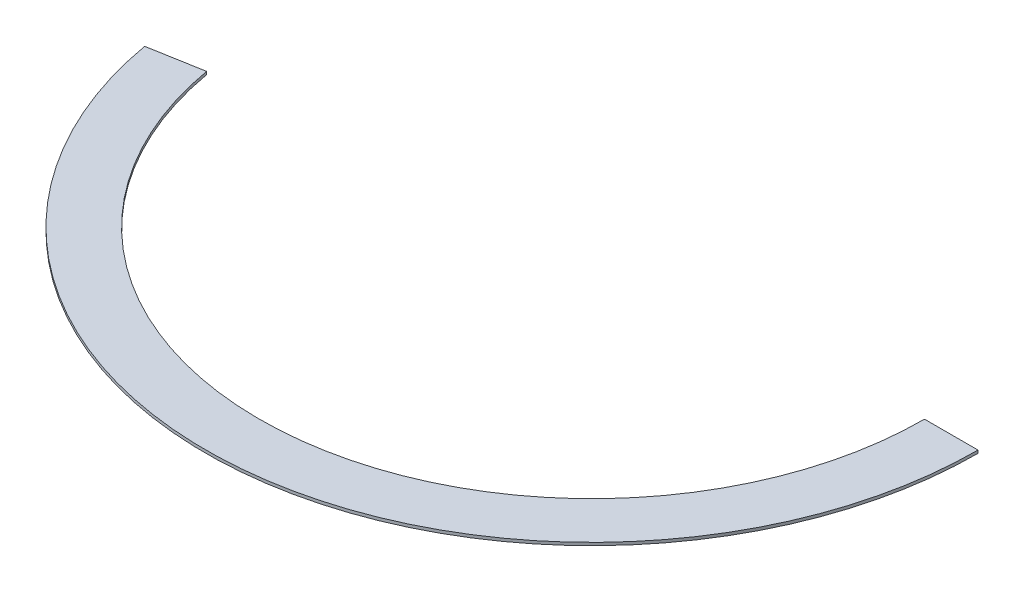
ISO-10303-21;
HEADER;
FILE_DESCRIPTION(('STEP AP214'),'2;1');
FILE_NAME('part.step','',(''),(''),'','','');
FILE_SCHEMA(('AUTOMOTIVE_DESIGN { 1 0 10303 214 1 1 1 1 }'));
ENDSEC;
DATA;
#1=APPLICATION_CONTEXT('core data for automotive mechanical design processes');
#2=APPLICATION_PROTOCOL_DEFINITION('international standard','automotive_design',2000,#1);
#3=PRODUCT_CONTEXT('',#1,'mechanical');
#4=PRODUCT('Part','Part','',(#3));
#5=PRODUCT_RELATED_PRODUCT_CATEGORY('part','',(#4));
#6=PRODUCT_DEFINITION_FORMATION('','',#4);
#7=PRODUCT_DEFINITION_CONTEXT('part definition',#1,'design');
#8=PRODUCT_DEFINITION('design','',#6,#7);
#9=PRODUCT_DEFINITION_SHAPE('','',#8);
#10=(LENGTH_UNIT() NAMED_UNIT(*) SI_UNIT(.MILLI.,.METRE.));
#11=(NAMED_UNIT(*) PLANE_ANGLE_UNIT() SI_UNIT($,.RADIAN.));
#12=(NAMED_UNIT(*) SI_UNIT($,.STERADIAN.) SOLID_ANGLE_UNIT());
#13=UNCERTAINTY_MEASURE_WITH_UNIT(LENGTH_MEASURE(1.E-05),#10,'distance_accuracy_value','');
#14=(GEOMETRIC_REPRESENTATION_CONTEXT(3) GLOBAL_UNCERTAINTY_ASSIGNED_CONTEXT((#13)) GLOBAL_UNIT_ASSIGNED_CONTEXT((#10,
#11,#12)) REPRESENTATION_CONTEXT('',''));
#15=CARTESIAN_POINT('',(0.,0.,0.));
#16=DIRECTION('',(0.,0.,1.));
#17=DIRECTION('',(1.,0.,0.));
#18=AXIS2_PLACEMENT_3D('',#15,#16,#17);
#19=CARTESIAN_POINT('',(0.,0.7,0.));
#20=DIRECTION('',(0.,-1.,0.));
#21=DIRECTION('',(0.,0.,-1.));
#22=AXIS2_PLACEMENT_3D('',#19,#20,#21);
#23=CYLINDRICAL_SURFACE('',#22,93.83);
#24=CARTESIAN_POINT('',(0.,0.,0.));
#25=DIRECTION('',(0.,1.,0.));
#26=DIRECTION('',(0.,0.,1.));
#27=AXIS2_PLACEMENT_3D('',#24,#25,#26);
#28=CIRCLE('',#27,93.83);
#29=CARTESIAN_POINT('',(-92.4045114651354,0.,16.2934085104888));
#30=VERTEX_POINT('',#29);
#31=CARTESIAN_POINT('',(93.83,0.,0.));
#32=VERTEX_POINT('',#31);
#33=EDGE_CURVE('E98',#30,#32,#28,.T.);
#34=ORIENTED_EDGE('',*,*,#33,.T.);
#35=DIRECTION('',(0.,-1.,0.));
#36=VECTOR('',#35,1.);
#37=CARTESIAN_POINT('',(93.83,0.7,0.));
#38=LINE('',#37,#36);
#39=CARTESIAN_POINT('',(93.83,0.7,0.));
#40=VERTEX_POINT('',#39);
#41=EDGE_CURVE('E11',#40,#32,#38,.T.);
#42=ORIENTED_EDGE('',*,*,#41,.F.);
#43=CARTESIAN_POINT('',(0.,0.7,0.));
#44=DIRECTION('',(0.,1.,0.));
#45=DIRECTION('',(0.,0.,1.));
#46=AXIS2_PLACEMENT_3D('',#43,#44,#45);
#47=CIRCLE('',#46,93.83);
#48=CARTESIAN_POINT('',(-92.4045114651354,0.7,16.2934085104888));
#49=VERTEX_POINT('',#48);
#50=EDGE_CURVE('E86',#49,#40,#47,.T.);
#51=ORIENTED_EDGE('',*,*,#50,.F.);
#52=DIRECTION('',(0.,-1.,0.));
#53=VECTOR('',#52,1.);
#54=CARTESIAN_POINT('',(-92.4045114651354,0.7,16.2934085104888));
#55=LINE('',#54,#53);
#56=EDGE_CURVE('E94',#49,#30,#55,.T.);
#57=ORIENTED_EDGE('',*,*,#56,.T.);
#58=EDGE_LOOP('',(#34,#42,#51,#57));
#59=FACE_BOUND('',#58,.T.);
#60=ADVANCED_FACE('F35',(#59),#23,.T.);
#61=CARTESIAN_POINT('',(80.83,0.7,0.));
#62=DIRECTION('',(0.,0.,1.));
#63=DIRECTION('',(1.,0.,0.));
#64=AXIS2_PLACEMENT_3D('',#61,#62,#63);
#65=PLANE('',#64);
#66=DIRECTION('',(-1.,0.,0.));
#67=VECTOR('',#66,1.);
#68=CARTESIAN_POINT('',(80.83,0.,0.));
#69=LINE('',#68,#67);
#70=CARTESIAN_POINT('',(80.83,0.,0.));
#71=VERTEX_POINT('',#70);
#72=EDGE_CURVE('E90',#32,#71,#69,.T.);
#73=ORIENTED_EDGE('',*,*,#72,.T.);
#74=DIRECTION('',(0.,-1.,0.));
#75=VECTOR('',#74,1.);
#76=CARTESIAN_POINT('',(80.83,0.7,0.));
#77=LINE('',#76,#75);
#78=CARTESIAN_POINT('',(80.83,0.7,0.));
#79=VERTEX_POINT('',#78);
#80=EDGE_CURVE('E43',#79,#71,#77,.T.);
#81=ORIENTED_EDGE('',*,*,#80,.F.);
#82=DIRECTION('',(-1.,0.,0.));
#83=VECTOR('',#82,1.);
#84=CARTESIAN_POINT('',(80.83,0.7,0.));
#85=LINE('',#84,#83);
#86=EDGE_CURVE('E81',#40,#79,#85,.T.);
#87=ORIENTED_EDGE('',*,*,#86,.F.);
#88=ORIENTED_EDGE('',*,*,#41,.T.);
#89=EDGE_LOOP('',(#73,#81,#87,#88));
#90=FACE_BOUND('',#89,.T.);
#91=ADVANCED_FACE('F89',(#90),#65,.F.);
#92=CARTESIAN_POINT('',(0.,0.7,0.));
#93=DIRECTION('',(0.,-1.,0.));
#94=DIRECTION('',(0.,0.,-1.));
#95=AXIS2_PLACEMENT_3D('',#92,#93,#94);
#96=CYLINDRICAL_SURFACE('',#95,80.83);
#97=CARTESIAN_POINT('',(0.,0.,0.));
#98=DIRECTION('',(0.,-1.,0.));
#99=DIRECTION('',(0.,0.,-1.));
#100=AXIS2_PLACEMENT_3D('',#97,#98,#99);
#101=CIRCLE('',#100,80.83);
#102=CARTESIAN_POINT('',(-79.6020106759767,0.,14.0359822008186));
#103=VERTEX_POINT('',#102);
#104=EDGE_CURVE('E68',#71,#103,#101,.T.);
#105=ORIENTED_EDGE('',*,*,#104,.T.);
#106=DIRECTION('',(0.,-1.,0.));
#107=VECTOR('',#106,1.);
#108=CARTESIAN_POINT('',(-79.6020106759767,0.7,14.0359822008186));
#109=LINE('',#108,#107);
#110=CARTESIAN_POINT('',(-79.6020106759767,0.7,14.0359822008186));
#111=VERTEX_POINT('',#110);
#112=EDGE_CURVE('E91',#111,#103,#109,.T.);
#113=ORIENTED_EDGE('',*,*,#112,.F.);
#114=CARTESIAN_POINT('',(0.,0.7,0.));
#115=DIRECTION('',(0.,-1.,0.));
#116=DIRECTION('',(0.,0.,-1.));
#117=AXIS2_PLACEMENT_3D('',#114,#115,#116);
#118=CIRCLE('',#117,80.83);
#119=EDGE_CURVE('E84',#79,#111,#118,.T.);
#120=ORIENTED_EDGE('',*,*,#119,.F.);
#121=ORIENTED_EDGE('',*,*,#80,.T.);
#122=EDGE_LOOP('',(#105,#113,#120,#121));
#123=FACE_BOUND('',#122,.T.);
#124=ADVANCED_FACE('F92',(#123),#96,.F.);
#125=CARTESIAN_POINT('',(-79.6020106759767,0.7,14.0359822008186));
#126=DIRECTION('',(0.173648177666938,0.,0.984807753012207));
#127=DIRECTION('',(0.984807753012207,0.,-0.173648177666938));
#128=AXIS2_PLACEMENT_3D('',#125,#126,#127);
#129=PLANE('',#128);
#130=DIRECTION('',(-0.984807753012207,0.,0.173648177666938));
#131=VECTOR('',#130,1.);
#132=CARTESIAN_POINT('',(-79.6020106759767,0.,14.0359822008186));
#133=LINE('',#132,#131);
#134=EDGE_CURVE('E74',#103,#30,#133,.T.);
#135=ORIENTED_EDGE('',*,*,#134,.T.);
#136=ORIENTED_EDGE('',*,*,#56,.F.);
#137=DIRECTION('',(-0.984807753012207,0.,0.173648177666938));
#138=VECTOR('',#137,1.);
#139=CARTESIAN_POINT('',(-79.6020106759767,0.7,14.0359822008186));
#140=LINE('',#139,#138);
#141=EDGE_CURVE('E51',#111,#49,#140,.T.);
#142=ORIENTED_EDGE('',*,*,#141,.F.);
#143=ORIENTED_EDGE('',*,*,#112,.T.);
#144=EDGE_LOOP('',(#135,#136,#142,#143));
#145=FACE_BOUND('',#144,.T.);
#146=ADVANCED_FACE('F105',(#145),#129,.F.);
#147=CARTESIAN_POINT('',(0.,0.7,0.));
#148=DIRECTION('',(0.,1.,0.));
#149=DIRECTION('',(0.,0.,1.));
#150=AXIS2_PLACEMENT_3D('',#147,#148,#149);
#151=PLANE('',#150);
#152=ORIENTED_EDGE('',*,*,#50,.T.);
#153=ORIENTED_EDGE('',*,*,#86,.T.);
#154=ORIENTED_EDGE('',*,*,#119,.T.);
#155=ORIENTED_EDGE('',*,*,#141,.T.);
#156=EDGE_LOOP('',(#152,#153,#154,#155));
#157=FACE_BOUND('',#156,.T.);
#158=ADVANCED_FACE('F82',(#157),#151,.T.);
#159=CARTESIAN_POINT('',(0.,0.,0.));
#160=DIRECTION('',(0.,1.,0.));
#161=DIRECTION('',(0.,0.,1.));
#162=AXIS2_PLACEMENT_3D('',#159,#160,#161);
#163=PLANE('',#162);
#164=ORIENTED_EDGE('',*,*,#33,.F.);
#165=ORIENTED_EDGE('',*,*,#134,.F.);
#166=ORIENTED_EDGE('',*,*,#104,.F.);
#167=ORIENTED_EDGE('',*,*,#72,.F.);
#168=EDGE_LOOP('',(#164,#165,#166,#167));
#169=FACE_BOUND('',#168,.T.);
#170=ADVANCED_FACE('F108',(#169),#163,.F.);
#171=CLOSED_SHELL('',(#60,#91,#124,#146,#158,#170));
#172=MANIFOLD_SOLID_BREP('B2',#171);
#173=ADVANCED_BREP_SHAPE_REPRESENTATION('',(#18,#172),#14);
#174=SHAPE_DEFINITION_REPRESENTATION(#9,#173);
ENDSEC;
END-ISO-10303-21;
